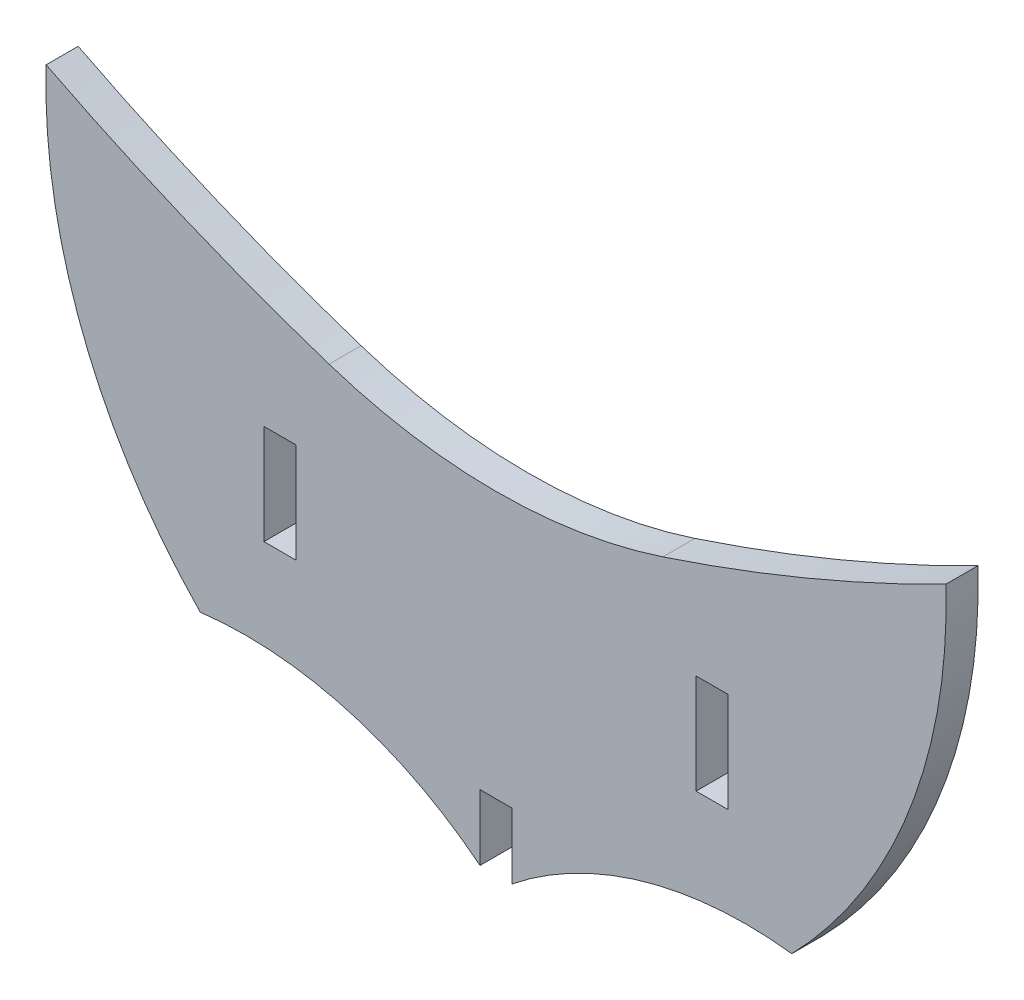
ISO-10303-21;
HEADER;
FILE_DESCRIPTION(('STEP AP214'),'2;1');
FILE_NAME('part.step','',(''),(''),'','','');
FILE_SCHEMA(('AUTOMOTIVE_DESIGN { 1 0 10303 214 1 1 1 1 }'));
ENDSEC;
DATA;
#1=APPLICATION_CONTEXT('core data for automotive mechanical design processes');
#2=APPLICATION_PROTOCOL_DEFINITION('international standard','automotive_design',2000,#1);
#3=PRODUCT_CONTEXT('',#1,'mechanical');
#4=PRODUCT('Part','Part','',(#3));
#5=PRODUCT_RELATED_PRODUCT_CATEGORY('part','',(#4));
#6=PRODUCT_DEFINITION_FORMATION('','',#4);
#7=PRODUCT_DEFINITION_CONTEXT('part definition',#1,'design');
#8=PRODUCT_DEFINITION('design','',#6,#7);
#9=PRODUCT_DEFINITION_SHAPE('','',#8);
#10=(LENGTH_UNIT() NAMED_UNIT(*) SI_UNIT(.MILLI.,.METRE.));
#11=(NAMED_UNIT(*) PLANE_ANGLE_UNIT() SI_UNIT($,.RADIAN.));
#12=(NAMED_UNIT(*) SI_UNIT($,.STERADIAN.) SOLID_ANGLE_UNIT());
#13=UNCERTAINTY_MEASURE_WITH_UNIT(LENGTH_MEASURE(1.E-05),#10,'distance_accuracy_value','');
#14=(GEOMETRIC_REPRESENTATION_CONTEXT(3) GLOBAL_UNCERTAINTY_ASSIGNED_CONTEXT((#13)) GLOBAL_UNIT_ASSIGNED_CONTEXT((#10,
#11,#12)) REPRESENTATION_CONTEXT('',''));
#15=CARTESIAN_POINT('',(0.,0.,0.));
#16=DIRECTION('',(0.,0.,1.));
#17=DIRECTION('',(1.,0.,0.));
#18=AXIS2_PLACEMENT_3D('',#15,#16,#17);
#19=CARTESIAN_POINT('',(-1.524,17.1378802822344,1.524));
#20=DIRECTION('',(0.,1.,0.));
#21=DIRECTION('',(0.,0.,1.));
#22=AXIS2_PLACEMENT_3D('',#19,#20,#21);
#23=PLANE('',#22);
#24=DIRECTION('',(1.,0.,0.));
#25=VECTOR('',#24,1.);
#26=CARTESIAN_POINT('',(-1.524,17.1378802822344,0.));
#27=LINE('',#26,#25);
#28=CARTESIAN_POINT('',(-1.524,17.1378802822344,0.));
#29=VERTEX_POINT('',#28);
#30=CARTESIAN_POINT('',(0.,17.1378802822344,0.));
#31=VERTEX_POINT('',#30);
#32=EDGE_CURVE('E198',#29,#31,#27,.T.);
#33=ORIENTED_EDGE('',*,*,#32,.T.);
#34=DIRECTION('',(0.,0.,-1.));
#35=VECTOR('',#34,1.);
#36=CARTESIAN_POINT('',(0.,17.1378802822344,1.524));
#37=LINE('',#36,#35);
#38=CARTESIAN_POINT('',(0.,17.1378802822344,1.524));
#39=VERTEX_POINT('',#38);
#40=EDGE_CURVE('E273',#39,#31,#37,.T.);
#41=ORIENTED_EDGE('',*,*,#40,.F.);
#42=DIRECTION('',(1.,0.,0.));
#43=VECTOR('',#42,1.);
#44=CARTESIAN_POINT('',(-1.524,17.1378802822344,1.524));
#45=LINE('',#44,#43);
#46=CARTESIAN_POINT('',(-1.524,17.1378802822344,1.524));
#47=VERTEX_POINT('',#46);
#48=EDGE_CURVE('E205',#47,#39,#45,.T.);
#49=ORIENTED_EDGE('',*,*,#48,.F.);
#50=DIRECTION('',(0.,0.,-1.));
#51=VECTOR('',#50,1.);
#52=CARTESIAN_POINT('',(-1.524,17.1378802822344,1.524));
#53=LINE('',#52,#51);
#54=EDGE_CURVE('E227',#47,#29,#53,.T.);
#55=ORIENTED_EDGE('',*,*,#54,.T.);
#56=EDGE_LOOP('',(#33,#41,#49,#55));
#57=FACE_BOUND('',#56,.T.);
#58=ADVANCED_FACE('F33',(#57),#23,.F.);
#59=CARTESIAN_POINT('',(0.,17.1378802822344,1.524));
#60=DIRECTION('',(1.,0.,0.));
#61=DIRECTION('',(0.,1.,0.));
#62=AXIS2_PLACEMENT_3D('',#59,#60,#61);
#63=PLANE('',#62);
#64=DIRECTION('',(0.,-1.,0.));
#65=VECTOR('',#64,1.);
#66=CARTESIAN_POINT('',(0.,17.1378802822344,0.));
#67=LINE('',#66,#65);
#68=CARTESIAN_POINT('',(0.,14.0090513605173,0.));
#69=VERTEX_POINT('',#68);
#70=EDGE_CURVE('E230',#31,#69,#67,.T.);
#71=ORIENTED_EDGE('',*,*,#70,.T.);
#72=DIRECTION('',(0.,0.,-1.));
#73=VECTOR('',#72,1.);
#74=CARTESIAN_POINT('',(0.,14.0090513605173,1.524));
#75=LINE('',#74,#73);
#76=CARTESIAN_POINT('',(0.,14.0090513605173,1.524));
#77=VERTEX_POINT('',#76);
#78=EDGE_CURVE('E270',#77,#69,#75,.T.);
#79=ORIENTED_EDGE('',*,*,#78,.F.);
#80=DIRECTION('',(0.,-1.,0.));
#81=VECTOR('',#80,1.);
#82=CARTESIAN_POINT('',(0.,17.1378802822344,1.524));
#83=LINE('',#82,#81);
#84=EDGE_CURVE('E208',#39,#77,#83,.T.);
#85=ORIENTED_EDGE('',*,*,#84,.F.);
#86=ORIENTED_EDGE('',*,*,#40,.T.);
#87=EDGE_LOOP('',(#71,#79,#85,#86));
#88=FACE_BOUND('',#87,.T.);
#89=ADVANCED_FACE('F310',(#88),#63,.F.);
#90=CARTESIAN_POINT('',(11.1464275812293,0.109149396201755,1.524));
#91=DIRECTION('',(0.,0.,-1.));
#92=DIRECTION('',(-1.,0.,0.));
#93=AXIS2_PLACEMENT_3D('',#90,#91,#92);
#94=CYLINDRICAL_SURFACE('',#93,17.8171300281828);
#95=CARTESIAN_POINT('',(11.1464275812293,0.109149396201755,0.));
#96=DIRECTION('',(0.,0.,-1.));
#97=DIRECTION('',(-1.,0.,0.));
#98=AXIS2_PLACEMENT_3D('',#95,#96,#97);
#99=CIRCLE('',#98,17.8171300281828);
#100=CARTESIAN_POINT('',(13.3180109816811,17.7934460453777,0.));
#101=VERTEX_POINT('',#100);
#102=EDGE_CURVE('E232',#69,#101,#99,.T.);
#103=ORIENTED_EDGE('',*,*,#102,.T.);
#104=DIRECTION('',(0.,0.,-1.));
#105=VECTOR('',#104,1.);
#106=CARTESIAN_POINT('',(13.3180109816811,17.7934460453777,1.524));
#107=LINE('',#106,#105);
#108=CARTESIAN_POINT('',(13.3180109816811,17.7934460453777,1.524));
#109=VERTEX_POINT('',#108);
#110=EDGE_CURVE('E267',#109,#101,#107,.T.);
#111=ORIENTED_EDGE('',*,*,#110,.F.);
#112=CARTESIAN_POINT('',(11.1464275812293,0.109149396201755,1.524));
#113=DIRECTION('',(0.,0.,-1.));
#114=DIRECTION('',(-1.,0.,0.));
#115=AXIS2_PLACEMENT_3D('',#112,#113,#114);
#116=CIRCLE('',#115,17.8171300281828);
#117=EDGE_CURVE('E211',#77,#109,#116,.T.);
#118=ORIENTED_EDGE('',*,*,#117,.F.);
#119=ORIENTED_EDGE('',*,*,#78,.T.);
#120=EDGE_LOOP('',(#103,#111,#118,#119));
#121=FACE_BOUND('',#120,.T.);
#122=ADVANCED_FACE('F315',(#121),#94,.F.);
#123=CARTESIAN_POINT('',(-5.24773889145483,35.8719496117146,1.524));
#124=DIRECTION('',(0.,0.,-1.));
#125=DIRECTION('',(-1.,0.,0.));
#126=AXIS2_PLACEMENT_3D('',#123,#124,#125);
#127=CYLINDRICAL_SURFACE('',#126,25.9136905814264);
#128=CARTESIAN_POINT('',(-5.24773889145483,35.8719496117146,0.));
#129=DIRECTION('',(0.,0.,1.));
#130=DIRECTION('',(-1.,0.,0.));
#131=AXIS2_PLACEMENT_3D('',#128,#129,#130);
#132=CIRCLE('',#131,25.9136905814264);
#133=CARTESIAN_POINT('',(20.652940370116,36.69303020407,0.));
#134=VERTEX_POINT('',#133);
#135=EDGE_CURVE('E234',#101,#134,#132,.T.);
#136=ORIENTED_EDGE('',*,*,#135,.T.);
#137=DIRECTION('',(0.,0.,-1.));
#138=VECTOR('',#137,1.);
#139=CARTESIAN_POINT('',(20.652940370116,36.69303020407,1.524));
#140=LINE('',#139,#138);
#141=CARTESIAN_POINT('',(20.652940370116,36.69303020407,1.524));
#142=VERTEX_POINT('',#141);
#143=EDGE_CURVE('E264',#142,#134,#140,.T.);
#144=ORIENTED_EDGE('',*,*,#143,.F.);
#145=CARTESIAN_POINT('',(-5.24773889145483,35.8719496117146,1.524));
#146=DIRECTION('',(0.,0.,1.));
#147=DIRECTION('',(-1.,0.,0.));
#148=AXIS2_PLACEMENT_3D('',#145,#146,#147);
#149=CIRCLE('',#148,25.9136905814264);
#150=EDGE_CURVE('E213',#109,#142,#149,.T.);
#151=ORIENTED_EDGE('',*,*,#150,.F.);
#152=ORIENTED_EDGE('',*,*,#110,.T.);
#153=EDGE_LOOP('',(#136,#144,#151,#152));
#154=FACE_BOUND('',#153,.T.);
#155=ADVANCED_FACE('F359',(#154),#127,.T.);
#156=CARTESIAN_POINT('',(-22.7218251624983,121.893989762758,1.524));
#157=DIRECTION('',(0.,0.,-1.));
#158=DIRECTION('',(-1.,0.,0.));
#159=AXIS2_PLACEMENT_3D('',#156,#157,#158);
#160=CYLINDRICAL_SURFACE('',#159,95.6063480880346);
#161=CARTESIAN_POINT('',(-22.7218251624983,121.893989762758,0.));
#162=DIRECTION('',(0.,0.,-1.));
#163=DIRECTION('',(-1.,0.,0.));
#164=AXIS2_PLACEMENT_3D('',#161,#162,#163);
#165=CIRCLE('',#164,95.6063480880346);
#166=CARTESIAN_POINT('',(7.18285932280703,31.0849393296388,0.));
#167=VERTEX_POINT('',#166);
#168=EDGE_CURVE('E236',#134,#167,#165,.T.);
#169=ORIENTED_EDGE('',*,*,#168,.T.);
#170=DIRECTION('',(0.,0.,-1.));
#171=VECTOR('',#170,1.);
#172=CARTESIAN_POINT('',(7.18285932280703,31.0849393296388,1.524));
#173=LINE('',#172,#171);
#174=CARTESIAN_POINT('',(7.18285932280703,31.0849393296388,1.524));
#175=VERTEX_POINT('',#174);
#176=EDGE_CURVE('E261',#175,#167,#173,.T.);
#177=ORIENTED_EDGE('',*,*,#176,.F.);
#178=CARTESIAN_POINT('',(-22.7218251624983,121.893989762758,1.524));
#179=DIRECTION('',(0.,0.,-1.));
#180=DIRECTION('',(-1.,0.,0.));
#181=AXIS2_PLACEMENT_3D('',#178,#179,#180);
#182=CIRCLE('',#181,95.6063480880346);
#183=EDGE_CURVE('E215',#142,#175,#182,.T.);
#184=ORIENTED_EDGE('',*,*,#183,.F.);
#185=ORIENTED_EDGE('',*,*,#143,.T.);
#186=EDGE_LOOP('',(#169,#177,#184,#185));
#187=FACE_BOUND('',#186,.T.);
#188=ADVANCED_FACE('F354',(#187),#160,.F.);
#189=CARTESIAN_POINT('',(-0.762000000000005,55.2104281400402,1.524));
#190=DIRECTION('',(0.,0.,-1.));
#191=DIRECTION('',(-1.,0.,0.));
#192=AXIS2_PLACEMENT_3D('',#189,#190,#191);
#193=CYLINDRICAL_SURFACE('',#192,25.4);
#194=CARTESIAN_POINT('',(-0.762000000000005,55.2104281400402,0.));
#195=DIRECTION('',(0.,0.,-1.));
#196=DIRECTION('',(-1.,0.,0.));
#197=AXIS2_PLACEMENT_3D('',#194,#195,#196);
#198=CIRCLE('',#197,25.4);
#199=CARTESIAN_POINT('',(-8.70685932280704,31.0849393296388,0.));
#200=VERTEX_POINT('',#199);
#201=EDGE_CURVE('E238',#167,#200,#198,.T.);
#202=ORIENTED_EDGE('',*,*,#201,.T.);
#203=DIRECTION('',(0.,0.,-1.));
#204=VECTOR('',#203,1.);
#205=CARTESIAN_POINT('',(-8.70685932280704,31.0849393296388,1.524));
#206=LINE('',#205,#204);
#207=CARTESIAN_POINT('',(-8.70685932280704,31.0849393296388,1.524));
#208=VERTEX_POINT('',#207);
#209=EDGE_CURVE('E258',#208,#200,#206,.T.);
#210=ORIENTED_EDGE('',*,*,#209,.F.);
#211=CARTESIAN_POINT('',(-0.762000000000005,55.2104281400402,1.524));
#212=DIRECTION('',(0.,0.,-1.));
#213=DIRECTION('',(-1.,0.,0.));
#214=AXIS2_PLACEMENT_3D('',#211,#212,#213);
#215=CIRCLE('',#214,25.4);
#216=EDGE_CURVE('E217',#175,#208,#215,.T.);
#217=ORIENTED_EDGE('',*,*,#216,.F.);
#218=ORIENTED_EDGE('',*,*,#176,.T.);
#219=EDGE_LOOP('',(#202,#210,#217,#218));
#220=FACE_BOUND('',#219,.T.);
#221=ADVANCED_FACE('F350',(#220),#193,.F.);
#222=CARTESIAN_POINT('',(21.1978251624983,121.893989762758,1.524));
#223=DIRECTION('',(0.,0.,-1.));
#224=DIRECTION('',(-1.,0.,0.));
#225=AXIS2_PLACEMENT_3D('',#222,#223,#224);
#226=CYLINDRICAL_SURFACE('',#225,95.6063480880347);
#227=CARTESIAN_POINT('',(21.1978251624983,121.893989762758,0.));
#228=DIRECTION('',(0.,0.,-1.));
#229=DIRECTION('',(1.,0.,0.));
#230=AXIS2_PLACEMENT_3D('',#227,#228,#229);
#231=CIRCLE('',#230,95.6063480880347);
#232=CARTESIAN_POINT('',(-22.176940370116,36.69303020407,0.));
#233=VERTEX_POINT('',#232);
#234=EDGE_CURVE('E240',#200,#233,#231,.T.);
#235=ORIENTED_EDGE('',*,*,#234,.T.);
#236=DIRECTION('',(0.,0.,-1.));
#237=VECTOR('',#236,1.);
#238=CARTESIAN_POINT('',(-22.176940370116,36.69303020407,1.524));
#239=LINE('',#238,#237);
#240=CARTESIAN_POINT('',(-22.176940370116,36.69303020407,1.524));
#241=VERTEX_POINT('',#240);
#242=EDGE_CURVE('E255',#241,#233,#239,.T.);
#243=ORIENTED_EDGE('',*,*,#242,.F.);
#244=CARTESIAN_POINT('',(21.1978251624983,121.893989762758,1.524));
#245=DIRECTION('',(0.,0.,-1.));
#246=DIRECTION('',(1.,0.,0.));
#247=AXIS2_PLACEMENT_3D('',#244,#245,#246);
#248=CIRCLE('',#247,95.6063480880347);
#249=EDGE_CURVE('E219',#208,#241,#248,.T.);
#250=ORIENTED_EDGE('',*,*,#249,.F.);
#251=ORIENTED_EDGE('',*,*,#209,.T.);
#252=EDGE_LOOP('',(#235,#243,#250,#251));
#253=FACE_BOUND('',#252,.T.);
#254=ADVANCED_FACE('F346',(#253),#226,.F.);
#255=CARTESIAN_POINT('',(3.72373889145483,35.8719496117147,1.524));
#256=DIRECTION('',(0.,0.,-1.));
#257=DIRECTION('',(-1.,0.,0.));
#258=AXIS2_PLACEMENT_3D('',#255,#256,#257);
#259=CYLINDRICAL_SURFACE('',#258,25.9136905814264);
#260=CARTESIAN_POINT('',(3.72373889145483,35.8719496117147,0.));
#261=DIRECTION('',(0.,0.,1.));
#262=DIRECTION('',(1.,0.,0.));
#263=AXIS2_PLACEMENT_3D('',#260,#261,#262);
#264=CIRCLE('',#263,25.9136905814264);
#265=CARTESIAN_POINT('',(-14.8420109816811,17.7934460453777,0.));
#266=VERTEX_POINT('',#265);
#267=EDGE_CURVE('E242',#233,#266,#264,.T.);
#268=ORIENTED_EDGE('',*,*,#267,.T.);
#269=DIRECTION('',(0.,0.,-1.));
#270=VECTOR('',#269,1.);
#271=CARTESIAN_POINT('',(-14.8420109816811,17.7934460453777,1.524));
#272=LINE('',#271,#270);
#273=CARTESIAN_POINT('',(-14.8420109816811,17.7934460453777,1.524));
#274=VERTEX_POINT('',#273);
#275=EDGE_CURVE('E252',#274,#266,#272,.T.);
#276=ORIENTED_EDGE('',*,*,#275,.F.);
#277=CARTESIAN_POINT('',(3.72373889145483,35.8719496117147,1.524));
#278=DIRECTION('',(0.,0.,1.));
#279=DIRECTION('',(1.,0.,0.));
#280=AXIS2_PLACEMENT_3D('',#277,#278,#279);
#281=CIRCLE('',#280,25.9136905814264);
#282=EDGE_CURVE('E221',#241,#274,#281,.T.);
#283=ORIENTED_EDGE('',*,*,#282,.F.);
#284=ORIENTED_EDGE('',*,*,#242,.T.);
#285=EDGE_LOOP('',(#268,#276,#283,#284));
#286=FACE_BOUND('',#285,.T.);
#287=ADVANCED_FACE('F341',(#286),#259,.T.);
#288=CARTESIAN_POINT('',(-12.6704275812293,0.109149396201741,1.524));
#289=DIRECTION('',(0.,0.,-1.));
#290=DIRECTION('',(-1.,0.,0.));
#291=AXIS2_PLACEMENT_3D('',#288,#289,#290);
#292=CYLINDRICAL_SURFACE('',#291,17.8171300281828);
#293=CARTESIAN_POINT('',(-12.6704275812293,0.109149396201741,0.));
#294=DIRECTION('',(0.,0.,-1.));
#295=DIRECTION('',(1.,0.,0.));
#296=AXIS2_PLACEMENT_3D('',#293,#294,#295);
#297=CIRCLE('',#296,17.8171300281828);
#298=CARTESIAN_POINT('',(-1.524,14.0090513605173,0.));
#299=VERTEX_POINT('',#298);
#300=EDGE_CURVE('E244',#266,#299,#297,.T.);
#301=ORIENTED_EDGE('',*,*,#300,.T.);
#302=DIRECTION('',(0.,0.,-1.));
#303=VECTOR('',#302,1.);
#304=CARTESIAN_POINT('',(-1.524,14.0090513605173,1.524));
#305=LINE('',#304,#303);
#306=CARTESIAN_POINT('',(-1.524,14.0090513605173,1.524));
#307=VERTEX_POINT('',#306);
#308=EDGE_CURVE('E249',#307,#299,#305,.T.);
#309=ORIENTED_EDGE('',*,*,#308,.F.);
#310=CARTESIAN_POINT('',(-12.6704275812293,0.109149396201741,1.524));
#311=DIRECTION('',(0.,0.,-1.));
#312=DIRECTION('',(1.,0.,0.));
#313=AXIS2_PLACEMENT_3D('',#310,#311,#312);
#314=CIRCLE('',#313,17.8171300281828);
#315=EDGE_CURVE('E223',#274,#307,#314,.T.);
#316=ORIENTED_EDGE('',*,*,#315,.F.);
#317=ORIENTED_EDGE('',*,*,#275,.T.);
#318=EDGE_LOOP('',(#301,#309,#316,#317));
#319=FACE_BOUND('',#318,.T.);
#320=ADVANCED_FACE('F335',(#319),#292,.F.);
#321=CARTESIAN_POINT('',(-1.524,17.1378802822344,1.524));
#322=DIRECTION('',(-1.,0.,0.));
#323=DIRECTION('',(0.,0.,1.));
#324=AXIS2_PLACEMENT_3D('',#321,#322,#323);
#325=PLANE('',#324);
#326=DIRECTION('',(0.,1.,0.));
#327=VECTOR('',#326,1.);
#328=CARTESIAN_POINT('',(-1.524,17.1378802822344,0.));
#329=LINE('',#328,#327);
#330=EDGE_CURVE('E209',#299,#29,#329,.T.);
#331=ORIENTED_EDGE('',*,*,#330,.T.);
#332=ORIENTED_EDGE('',*,*,#54,.F.);
#333=DIRECTION('',(0.,1.,0.));
#334=VECTOR('',#333,1.);
#335=CARTESIAN_POINT('',(-1.524,17.1378802822344,1.524));
#336=LINE('',#335,#334);
#337=EDGE_CURVE('E225',#307,#47,#336,.T.);
#338=ORIENTED_EDGE('',*,*,#337,.F.);
#339=ORIENTED_EDGE('',*,*,#308,.T.);
#340=EDGE_LOOP('',(#331,#332,#338,#339));
#341=FACE_BOUND('',#340,.T.);
#342=ADVANCED_FACE('F333',(#341),#325,.F.);
#343=CARTESIAN_POINT('',(11.1464275812293,0.109149396201755,1.524));
#344=DIRECTION('',(0.,0.,-1.));
#345=DIRECTION('',(-1.,0.,0.));
#346=AXIS2_PLACEMENT_3D('',#343,#344,#345);
#347=PLANE('',#346);
#348=DIRECTION('',(0.,-1.,0.));
#349=VECTOR('',#348,1.);
#350=CARTESIAN_POINT('',(8.763,26.9676802822344,1.524));
#351=LINE('',#350,#349);
#352=CARTESIAN_POINT('',(8.763,26.9676802822344,1.524));
#353=VERTEX_POINT('',#352);
#354=CARTESIAN_POINT('',(8.763,22.2178802822344,1.524));
#355=VERTEX_POINT('',#354);
#356=EDGE_CURVE('E168',#353,#355,#351,.T.);
#357=ORIENTED_EDGE('',*,*,#356,.F.);
#358=DIRECTION('',(-1.,0.,0.));
#359=VECTOR('',#358,1.);
#360=CARTESIAN_POINT('',(10.287,26.9676802822344,1.524));
#361=LINE('',#360,#359);
#362=CARTESIAN_POINT('',(10.287,26.9676802822344,1.524));
#363=VERTEX_POINT('',#362);
#364=EDGE_CURVE('E47',#363,#353,#361,.T.);
#365=ORIENTED_EDGE('',*,*,#364,.F.);
#366=DIRECTION('',(0.,1.,0.));
#367=VECTOR('',#366,1.);
#368=CARTESIAN_POINT('',(10.287,26.9676802822344,1.524));
#369=LINE('',#368,#367);
#370=CARTESIAN_POINT('',(10.287,22.2178802822344,1.524));
#371=VERTEX_POINT('',#370);
#372=EDGE_CURVE('E175',#371,#363,#369,.T.);
#373=ORIENTED_EDGE('',*,*,#372,.F.);
#374=DIRECTION('',(1.,0.,0.));
#375=VECTOR('',#374,1.);
#376=CARTESIAN_POINT('',(10.287,22.2178802822344,1.524));
#377=LINE('',#376,#375);
#378=EDGE_CURVE('E159',#355,#371,#377,.T.);
#379=ORIENTED_EDGE('',*,*,#378,.F.);
#380=EDGE_LOOP('',(#357,#365,#373,#379));
#381=FACE_BOUND('',#380,.T.);
#382=DIRECTION('',(1.,0.,0.));
#383=VECTOR('',#382,1.);
#384=CARTESIAN_POINT('',(-11.811,22.2178802822344,1.524));
#385=LINE('',#384,#383);
#386=CARTESIAN_POINT('',(-11.811,22.2178802822344,1.524));
#387=VERTEX_POINT('',#386);
#388=CARTESIAN_POINT('',(-10.287,22.2178802822344,1.524));
#389=VERTEX_POINT('',#388);
#390=EDGE_CURVE('E186',#387,#389,#385,.T.);
#391=ORIENTED_EDGE('',*,*,#390,.F.);
#392=DIRECTION('',(0.,-1.,0.));
#393=VECTOR('',#392,1.);
#394=CARTESIAN_POINT('',(-11.811,26.9676802822344,1.524));
#395=LINE('',#394,#393);
#396=CARTESIAN_POINT('',(-11.811,26.9676802822344,1.524));
#397=VERTEX_POINT('',#396);
#398=EDGE_CURVE('E182',#397,#387,#395,.T.);
#399=ORIENTED_EDGE('',*,*,#398,.F.);
#400=DIRECTION('',(-1.,0.,0.));
#401=VECTOR('',#400,1.);
#402=CARTESIAN_POINT('',(-11.811,26.9676802822344,1.524));
#403=LINE('',#402,#401);
#404=CARTESIAN_POINT('',(-10.287,26.9676802822344,1.524));
#405=VERTEX_POINT('',#404);
#406=EDGE_CURVE('E192',#405,#397,#403,.T.);
#407=ORIENTED_EDGE('',*,*,#406,.F.);
#408=DIRECTION('',(0.,1.,0.));
#409=VECTOR('',#408,1.);
#410=CARTESIAN_POINT('',(-10.287,26.9676802822344,1.524));
#411=LINE('',#410,#409);
#412=EDGE_CURVE('E189',#389,#405,#411,.T.);
#413=ORIENTED_EDGE('',*,*,#412,.F.);
#414=EDGE_LOOP('',(#391,#399,#407,#413));
#415=FACE_BOUND('',#414,.T.);
#416=ORIENTED_EDGE('',*,*,#48,.T.);
#417=ORIENTED_EDGE('',*,*,#84,.T.);
#418=ORIENTED_EDGE('',*,*,#117,.T.);
#419=ORIENTED_EDGE('',*,*,#150,.T.);
#420=ORIENTED_EDGE('',*,*,#183,.T.);
#421=ORIENTED_EDGE('',*,*,#216,.T.);
#422=ORIENTED_EDGE('',*,*,#249,.T.);
#423=ORIENTED_EDGE('',*,*,#282,.T.);
#424=ORIENTED_EDGE('',*,*,#315,.T.);
#425=ORIENTED_EDGE('',*,*,#337,.T.);
#426=EDGE_LOOP('',(#416,#417,#418,#419,#420,#421,#422,#423,#424,#425));
#427=FACE_BOUND('',#426,.T.);
#428=ADVANCED_FACE('F172',(#381,#415,#427),#347,.F.);
#429=CARTESIAN_POINT('',(11.1464275812293,0.109149396201755,0.));
#430=DIRECTION('',(0.,0.,-1.));
#431=DIRECTION('',(-1.,0.,0.));
#432=AXIS2_PLACEMENT_3D('',#429,#430,#431);
#433=PLANE('',#432);
#434=DIRECTION('',(1.,0.,0.));
#435=VECTOR('',#434,1.);
#436=CARTESIAN_POINT('',(11.1464275812293,26.9676802822344,0.));
#437=LINE('',#436,#435);
#438=CARTESIAN_POINT('',(8.763,26.9676802822344,0.));
#439=VERTEX_POINT('',#438);
#440=CARTESIAN_POINT('',(10.287,26.9676802822344,0.));
#441=VERTEX_POINT('',#440);
#442=EDGE_CURVE('E11',#439,#441,#437,.T.);
#443=ORIENTED_EDGE('',*,*,#442,.F.);
#444=DIRECTION('',(0.,1.,0.));
#445=VECTOR('',#444,1.);
#446=CARTESIAN_POINT('',(8.76300000000001,0.109149396201754,0.));
#447=LINE('',#446,#445);
#448=CARTESIAN_POINT('',(8.763,22.2178802822344,0.));
#449=VERTEX_POINT('',#448);
#450=EDGE_CURVE('E285',#449,#439,#447,.T.);
#451=ORIENTED_EDGE('',*,*,#450,.F.);
#452=DIRECTION('',(-1.,0.,0.));
#453=VECTOR('',#452,1.);
#454=CARTESIAN_POINT('',(11.1464275812293,22.2178802822344,0.));
#455=LINE('',#454,#453);
#456=CARTESIAN_POINT('',(10.287,22.2178802822344,0.));
#457=VERTEX_POINT('',#456);
#458=EDGE_CURVE('E162',#457,#449,#455,.T.);
#459=ORIENTED_EDGE('',*,*,#458,.F.);
#460=DIRECTION('',(0.,-1.,0.));
#461=VECTOR('',#460,1.);
#462=CARTESIAN_POINT('',(10.287,0.109149396201755,0.));
#463=LINE('',#462,#461);
#464=EDGE_CURVE('E40',#441,#457,#463,.T.);
#465=ORIENTED_EDGE('',*,*,#464,.F.);
#466=EDGE_LOOP('',(#443,#451,#459,#465));
#467=FACE_BOUND('',#466,.T.);
#468=DIRECTION('',(0.,1.,0.));
#469=VECTOR('',#468,1.);
#470=CARTESIAN_POINT('',(-11.811,0.109149396201755,0.));
#471=LINE('',#470,#469);
#472=CARTESIAN_POINT('',(-11.811,22.2178802822344,0.));
#473=VERTEX_POINT('',#472);
#474=CARTESIAN_POINT('',(-11.811,26.9676802822344,0.));
#475=VERTEX_POINT('',#474);
#476=EDGE_CURVE('E283',#473,#475,#471,.T.);
#477=ORIENTED_EDGE('',*,*,#476,.F.);
#478=DIRECTION('',(-1.,0.,0.));
#479=VECTOR('',#478,1.);
#480=CARTESIAN_POINT('',(11.1464275812293,22.2178802822344,0.));
#481=LINE('',#480,#479);
#482=CARTESIAN_POINT('',(-10.287,22.2178802822344,0.));
#483=VERTEX_POINT('',#482);
#484=EDGE_CURVE('E276',#483,#473,#481,.T.);
#485=ORIENTED_EDGE('',*,*,#484,.F.);
#486=DIRECTION('',(0.,-1.,0.));
#487=VECTOR('',#486,1.);
#488=CARTESIAN_POINT('',(-10.287,0.109149396201763,0.));
#489=LINE('',#488,#487);
#490=CARTESIAN_POINT('',(-10.287,26.9676802822344,0.));
#491=VERTEX_POINT('',#490);
#492=EDGE_CURVE('E278',#491,#483,#489,.T.);
#493=ORIENTED_EDGE('',*,*,#492,.F.);
#494=DIRECTION('',(1.,0.,0.));
#495=VECTOR('',#494,1.);
#496=CARTESIAN_POINT('',(11.1464275812293,26.9676802822344,0.));
#497=LINE('',#496,#495);
#498=EDGE_CURVE('E281',#475,#491,#497,.T.);
#499=ORIENTED_EDGE('',*,*,#498,.F.);
#500=EDGE_LOOP('',(#477,#485,#493,#499));
#501=FACE_BOUND('',#500,.T.);
#502=ORIENTED_EDGE('',*,*,#32,.F.);
#503=ORIENTED_EDGE('',*,*,#330,.F.);
#504=ORIENTED_EDGE('',*,*,#300,.F.);
#505=ORIENTED_EDGE('',*,*,#267,.F.);
#506=ORIENTED_EDGE('',*,*,#234,.F.);
#507=ORIENTED_EDGE('',*,*,#201,.F.);
#508=ORIENTED_EDGE('',*,*,#168,.F.);
#509=ORIENTED_EDGE('',*,*,#135,.F.);
#510=ORIENTED_EDGE('',*,*,#102,.F.);
#511=ORIENTED_EDGE('',*,*,#70,.F.);
#512=EDGE_LOOP('',(#502,#503,#504,#505,#506,#507,#508,#509,#510,#511));
#513=FACE_BOUND('',#512,.T.);
#514=ADVANCED_FACE('F293',(#467,#501,#513),#433,.T.);
#515=CARTESIAN_POINT('',(-11.811,26.9676802822344,-1.016));
#516=DIRECTION('',(-1.,0.,0.));
#517=DIRECTION('',(0.,0.,1.));
#518=AXIS2_PLACEMENT_3D('',#515,#516,#517);
#519=PLANE('',#518);
#520=ORIENTED_EDGE('',*,*,#476,.T.);
#521=DIRECTION('',(0.,0.,1.));
#522=VECTOR('',#521,1.);
#523=CARTESIAN_POINT('',(-11.811,26.9676802822344,-1.016));
#524=LINE('',#523,#522);
#525=EDGE_CURVE('E196',#475,#397,#524,.T.);
#526=ORIENTED_EDGE('',*,*,#525,.T.);
#527=ORIENTED_EDGE('',*,*,#398,.T.);
#528=DIRECTION('',(0.,0.,1.));
#529=VECTOR('',#528,1.);
#530=CARTESIAN_POINT('',(-11.811,22.2178802822344,-1.016));
#531=LINE('',#530,#529);
#532=EDGE_CURVE('E195',#473,#387,#531,.T.);
#533=ORIENTED_EDGE('',*,*,#532,.F.);
#534=EDGE_LOOP('',(#520,#526,#527,#533));
#535=FACE_BOUND('',#534,.T.);
#536=ADVANCED_FACE('F383',(#535),#519,.F.);
#537=CARTESIAN_POINT('',(-11.811,26.9676802822344,-1.016));
#538=DIRECTION('',(0.,1.,0.));
#539=DIRECTION('',(0.,0.,1.));
#540=AXIS2_PLACEMENT_3D('',#537,#538,#539);
#541=PLANE('',#540);
#542=ORIENTED_EDGE('',*,*,#498,.T.);
#543=DIRECTION('',(0.,0.,1.));
#544=VECTOR('',#543,1.);
#545=CARTESIAN_POINT('',(-10.287,26.9676802822344,-1.016));
#546=LINE('',#545,#544);
#547=EDGE_CURVE('E199',#491,#405,#546,.T.);
#548=ORIENTED_EDGE('',*,*,#547,.T.);
#549=ORIENTED_EDGE('',*,*,#406,.T.);
#550=ORIENTED_EDGE('',*,*,#525,.F.);
#551=EDGE_LOOP('',(#542,#548,#549,#550));
#552=FACE_BOUND('',#551,.T.);
#553=ADVANCED_FACE('F387',(#552),#541,.F.);
#554=CARTESIAN_POINT('',(-10.287,26.9676802822344,-1.016));
#555=DIRECTION('',(1.,0.,0.));
#556=DIRECTION('',(0.,1.,0.));
#557=AXIS2_PLACEMENT_3D('',#554,#555,#556);
#558=PLANE('',#557);
#559=ORIENTED_EDGE('',*,*,#492,.T.);
#560=DIRECTION('',(0.,0.,1.));
#561=VECTOR('',#560,1.);
#562=CARTESIAN_POINT('',(-10.287,22.2178802822344,-1.016));
#563=LINE('',#562,#561);
#564=EDGE_CURVE('E201',#483,#389,#563,.T.);
#565=ORIENTED_EDGE('',*,*,#564,.T.);
#566=ORIENTED_EDGE('',*,*,#412,.T.);
#567=ORIENTED_EDGE('',*,*,#547,.F.);
#568=EDGE_LOOP('',(#559,#565,#566,#567));
#569=FACE_BOUND('',#568,.T.);
#570=ADVANCED_FACE('F304',(#569),#558,.F.);
#571=CARTESIAN_POINT('',(-11.811,22.2178802822344,-1.016));
#572=DIRECTION('',(0.,-1.,0.));
#573=DIRECTION('',(0.,0.,-1.));
#574=AXIS2_PLACEMENT_3D('',#571,#572,#573);
#575=PLANE('',#574);
#576=ORIENTED_EDGE('',*,*,#484,.T.);
#577=ORIENTED_EDGE('',*,*,#532,.T.);
#578=ORIENTED_EDGE('',*,*,#390,.T.);
#579=ORIENTED_EDGE('',*,*,#564,.F.);
#580=EDGE_LOOP('',(#576,#577,#578,#579));
#581=FACE_BOUND('',#580,.T.);
#582=ADVANCED_FACE('F297',(#581),#575,.F.);
#583=CARTESIAN_POINT('',(10.287,26.9676802822344,-1.016));
#584=DIRECTION('',(0.,1.,0.));
#585=DIRECTION('',(0.,0.,1.));
#586=AXIS2_PLACEMENT_3D('',#583,#584,#585);
#587=PLANE('',#586);
#588=ORIENTED_EDGE('',*,*,#442,.T.);
#589=DIRECTION('',(0.,0.,1.));
#590=VECTOR('',#589,1.);
#591=CARTESIAN_POINT('',(10.287,26.9676802822344,-1.016));
#592=LINE('',#591,#590);
#593=EDGE_CURVE('E180',#441,#363,#592,.T.);
#594=ORIENTED_EDGE('',*,*,#593,.T.);
#595=ORIENTED_EDGE('',*,*,#364,.T.);
#596=DIRECTION('',(0.,0.,1.));
#597=VECTOR('',#596,1.);
#598=CARTESIAN_POINT('',(8.763,26.9676802822344,-1.016));
#599=LINE('',#598,#597);
#600=EDGE_CURVE('E165',#439,#353,#599,.T.);
#601=ORIENTED_EDGE('',*,*,#600,.F.);
#602=EDGE_LOOP('',(#588,#594,#595,#601));
#603=FACE_BOUND('',#602,.T.);
#604=ADVANCED_FACE('F295',(#603),#587,.F.);
#605=CARTESIAN_POINT('',(10.287,26.9676802822344,-1.016));
#606=DIRECTION('',(1.,0.,0.));
#607=DIRECTION('',(0.,0.,-1.));
#608=AXIS2_PLACEMENT_3D('',#605,#606,#607);
#609=PLANE('',#608);
#610=ORIENTED_EDGE('',*,*,#464,.T.);
#611=DIRECTION('',(0.,0.,1.));
#612=VECTOR('',#611,1.);
#613=CARTESIAN_POINT('',(10.287,22.2178802822344,-1.016));
#614=LINE('',#613,#612);
#615=EDGE_CURVE('E164',#457,#371,#614,.T.);
#616=ORIENTED_EDGE('',*,*,#615,.T.);
#617=ORIENTED_EDGE('',*,*,#372,.T.);
#618=ORIENTED_EDGE('',*,*,#593,.F.);
#619=EDGE_LOOP('',(#610,#616,#617,#618));
#620=FACE_BOUND('',#619,.T.);
#621=ADVANCED_FACE('F290',(#620),#609,.F.);
#622=CARTESIAN_POINT('',(10.287,22.2178802822344,-1.016));
#623=DIRECTION('',(0.,-1.,0.));
#624=DIRECTION('',(0.,0.,-1.));
#625=AXIS2_PLACEMENT_3D('',#622,#623,#624);
#626=PLANE('',#625);
#627=ORIENTED_EDGE('',*,*,#458,.T.);
#628=DIRECTION('',(0.,0.,1.));
#629=VECTOR('',#628,1.);
#630=CARTESIAN_POINT('',(8.763,22.2178802822344,-1.016));
#631=LINE('',#630,#629);
#632=EDGE_CURVE('E55',#449,#355,#631,.T.);
#633=ORIENTED_EDGE('',*,*,#632,.T.);
#634=ORIENTED_EDGE('',*,*,#378,.T.);
#635=ORIENTED_EDGE('',*,*,#615,.F.);
#636=EDGE_LOOP('',(#627,#633,#634,#635));
#637=FACE_BOUND('',#636,.T.);
#638=ADVANCED_FACE('F156',(#637),#626,.F.);
#639=CARTESIAN_POINT('',(8.763,26.9676802822344,-1.016));
#640=DIRECTION('',(-1.,0.,0.));
#641=DIRECTION('',(0.,-1.,0.));
#642=AXIS2_PLACEMENT_3D('',#639,#640,#641);
#643=PLANE('',#642);
#644=ORIENTED_EDGE('',*,*,#450,.T.);
#645=ORIENTED_EDGE('',*,*,#600,.T.);
#646=ORIENTED_EDGE('',*,*,#356,.T.);
#647=ORIENTED_EDGE('',*,*,#632,.F.);
#648=EDGE_LOOP('',(#644,#645,#646,#647));
#649=FACE_BOUND('',#648,.T.);
#650=ADVANCED_FACE('F169',(#649),#643,.F.);
#651=CLOSED_SHELL('',(#58,#89,#122,#155,#188,#221,#254,#287,#320,#342,#428,#514,#536,#553,#570,
#582,#604,#621,#638,#650));
#652=MANIFOLD_SOLID_BREP('B2',#651);
#653=ADVANCED_BREP_SHAPE_REPRESENTATION('',(#18,#652),#14);
#654=SHAPE_DEFINITION_REPRESENTATION(#9,#653);
ENDSEC;
END-ISO-10303-21;
